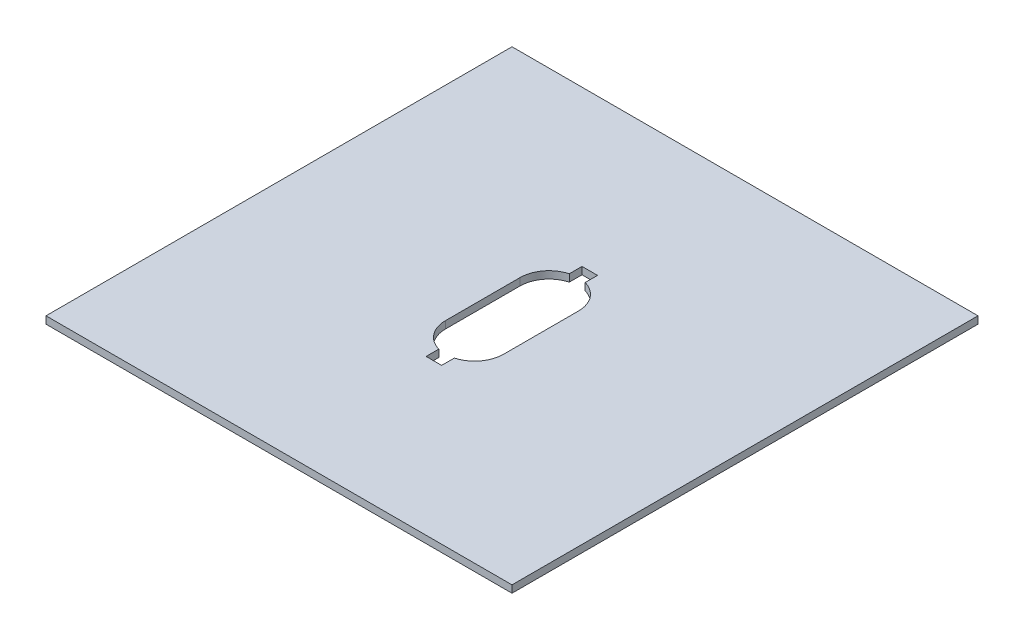
ISO-10303-21;
HEADER;
FILE_DESCRIPTION(('STEP AP214'),'2;1');
FILE_NAME('part.step','',(''),(''),'','','');
FILE_SCHEMA(('AUTOMOTIVE_DESIGN { 1 0 10303 214 1 1 1 1 }'));
ENDSEC;
DATA;
#1=APPLICATION_CONTEXT('core data for automotive mechanical design processes');
#2=APPLICATION_PROTOCOL_DEFINITION('international standard','automotive_design',2000,#1);
#3=PRODUCT_CONTEXT('',#1,'mechanical');
#4=PRODUCT('Part','Part','',(#3));
#5=PRODUCT_RELATED_PRODUCT_CATEGORY('part','',(#4));
#6=PRODUCT_DEFINITION_FORMATION('','',#4);
#7=PRODUCT_DEFINITION_CONTEXT('part definition',#1,'design');
#8=PRODUCT_DEFINITION('design','',#6,#7);
#9=PRODUCT_DEFINITION_SHAPE('','',#8);
#10=(LENGTH_UNIT() NAMED_UNIT(*) SI_UNIT(.MILLI.,.METRE.));
#11=(NAMED_UNIT(*) PLANE_ANGLE_UNIT() SI_UNIT($,.RADIAN.));
#12=(NAMED_UNIT(*) SI_UNIT($,.STERADIAN.) SOLID_ANGLE_UNIT());
#13=UNCERTAINTY_MEASURE_WITH_UNIT(LENGTH_MEASURE(1.E-05),#10,'distance_accuracy_value','');
#14=(GEOMETRIC_REPRESENTATION_CONTEXT(3) GLOBAL_UNCERTAINTY_ASSIGNED_CONTEXT((#13)) GLOBAL_UNIT_ASSIGNED_CONTEXT((#10,
#11,#12)) REPRESENTATION_CONTEXT('',''));
#15=CARTESIAN_POINT('',(0.,0.,0.));
#16=DIRECTION('',(0.,0.,1.));
#17=DIRECTION('',(1.,0.,0.));
#18=AXIS2_PLACEMENT_3D('',#15,#16,#17);
#19=CARTESIAN_POINT('',(152.4,2.38125,152.4));
#20=DIRECTION('',(-1.,0.,0.));
#21=DIRECTION('',(0.,0.,1.));
#22=AXIS2_PLACEMENT_3D('',#19,#20,#21);
#23=PLANE('',#22);
#24=DIRECTION('',(0.,0.,-1.));
#25=VECTOR('',#24,1.);
#26=CARTESIAN_POINT('',(152.4,-2.38125,152.4));
#27=LINE('',#26,#25);
#28=CARTESIAN_POINT('',(152.4,-2.38125,152.4));
#29=VERTEX_POINT('',#28);
#30=CARTESIAN_POINT('',(152.4,-2.38125,-152.4));
#31=VERTEX_POINT('',#30);
#32=EDGE_CURVE('E258',#29,#31,#27,.T.);
#33=ORIENTED_EDGE('',*,*,#32,.T.);
#34=DIRECTION('',(0.,-1.,0.));
#35=VECTOR('',#34,1.);
#36=CARTESIAN_POINT('',(152.4,2.38125,-152.4));
#37=LINE('',#36,#35);
#38=CARTESIAN_POINT('',(152.4,2.38125,-152.4));
#39=VERTEX_POINT('',#38);
#40=EDGE_CURVE('E11',#39,#31,#37,.T.);
#41=ORIENTED_EDGE('',*,*,#40,.F.);
#42=DIRECTION('',(0.,0.,-1.));
#43=VECTOR('',#42,1.);
#44=CARTESIAN_POINT('',(152.4,2.38125,152.4));
#45=LINE('',#44,#43);
#46=CARTESIAN_POINT('',(152.4,2.38125,152.4));
#47=VERTEX_POINT('',#46);
#48=EDGE_CURVE('E288',#47,#39,#45,.T.);
#49=ORIENTED_EDGE('',*,*,#48,.F.);
#50=DIRECTION('',(0.,-1.,0.));
#51=VECTOR('',#50,1.);
#52=CARTESIAN_POINT('',(152.4,2.38125,152.4));
#53=LINE('',#52,#51);
#54=EDGE_CURVE('E302',#47,#29,#53,.T.);
#55=ORIENTED_EDGE('',*,*,#54,.T.);
#56=EDGE_LOOP('',(#33,#41,#49,#55));
#57=FACE_BOUND('',#56,.T.);
#58=ADVANCED_FACE('F38',(#57),#23,.F.);
#59=CARTESIAN_POINT('',(-152.4,2.38125,-152.4));
#60=DIRECTION('',(0.,0.,1.));
#61=DIRECTION('',(1.,0.,0.));
#62=AXIS2_PLACEMENT_3D('',#59,#60,#61);
#63=PLANE('',#62);
#64=DIRECTION('',(-1.,0.,0.));
#65=VECTOR('',#64,1.);
#66=CARTESIAN_POINT('',(-152.4,-2.38125,-152.4));
#67=LINE('',#66,#65);
#68=CARTESIAN_POINT('',(-152.4,-2.38125,-152.4));
#69=VERTEX_POINT('',#68);
#70=EDGE_CURVE('E306',#31,#69,#67,.T.);
#71=ORIENTED_EDGE('',*,*,#70,.T.);
#72=DIRECTION('',(0.,-1.,0.));
#73=VECTOR('',#72,1.);
#74=CARTESIAN_POINT('',(-152.4,2.38125,-152.4));
#75=LINE('',#74,#73);
#76=CARTESIAN_POINT('',(-152.4,2.38125,-152.4));
#77=VERTEX_POINT('',#76);
#78=EDGE_CURVE('E46',#77,#69,#75,.T.);
#79=ORIENTED_EDGE('',*,*,#78,.F.);
#80=DIRECTION('',(-1.,0.,0.));
#81=VECTOR('',#80,1.);
#82=CARTESIAN_POINT('',(-152.4,2.38125,-152.4));
#83=LINE('',#82,#81);
#84=EDGE_CURVE('E292',#39,#77,#83,.T.);
#85=ORIENTED_EDGE('',*,*,#84,.F.);
#86=ORIENTED_EDGE('',*,*,#40,.T.);
#87=EDGE_LOOP('',(#71,#79,#85,#86));
#88=FACE_BOUND('',#87,.T.);
#89=ADVANCED_FACE('F340',(#88),#63,.F.);
#90=CARTESIAN_POINT('',(-152.4,2.38125,152.4));
#91=DIRECTION('',(1.,0.,0.));
#92=DIRECTION('',(0.,0.,-1.));
#93=AXIS2_PLACEMENT_3D('',#90,#91,#92);
#94=PLANE('',#93);
#95=DIRECTION('',(0.,0.,1.));
#96=VECTOR('',#95,1.);
#97=CARTESIAN_POINT('',(-152.4,-2.38125,152.4));
#98=LINE('',#97,#96);
#99=CARTESIAN_POINT('',(-152.4,-2.38125,152.4));
#100=VERTEX_POINT('',#99);
#101=EDGE_CURVE('E309',#69,#100,#98,.T.);
#102=ORIENTED_EDGE('',*,*,#101,.T.);
#103=DIRECTION('',(0.,-1.,0.));
#104=VECTOR('',#103,1.);
#105=CARTESIAN_POINT('',(-152.4,2.38125,152.4));
#106=LINE('',#105,#104);
#107=CARTESIAN_POINT('',(-152.4,2.38125,152.4));
#108=VERTEX_POINT('',#107);
#109=EDGE_CURVE('E317',#108,#100,#106,.T.);
#110=ORIENTED_EDGE('',*,*,#109,.F.);
#111=DIRECTION('',(0.,0.,1.));
#112=VECTOR('',#111,1.);
#113=CARTESIAN_POINT('',(-152.4,2.38125,152.4));
#114=LINE('',#113,#112);
#115=EDGE_CURVE('E296',#77,#108,#114,.T.);
#116=ORIENTED_EDGE('',*,*,#115,.F.);
#117=ORIENTED_EDGE('',*,*,#78,.T.);
#118=EDGE_LOOP('',(#102,#110,#116,#117));
#119=FACE_BOUND('',#118,.T.);
#120=ADVANCED_FACE('F326',(#119),#94,.F.);
#121=CARTESIAN_POINT('',(-152.4,2.38125,152.4));
#122=DIRECTION('',(0.,0.,-1.));
#123=DIRECTION('',(-1.,0.,0.));
#124=AXIS2_PLACEMENT_3D('',#121,#122,#123);
#125=PLANE('',#124);
#126=DIRECTION('',(1.,0.,0.));
#127=VECTOR('',#126,1.);
#128=CARTESIAN_POINT('',(-152.4,-2.38125,152.4));
#129=LINE('',#128,#127);
#130=EDGE_CURVE('E293',#100,#29,#129,.T.);
#131=ORIENTED_EDGE('',*,*,#130,.T.);
#132=ORIENTED_EDGE('',*,*,#54,.F.);
#133=DIRECTION('',(1.,0.,0.));
#134=VECTOR('',#133,1.);
#135=CARTESIAN_POINT('',(-152.4,2.38125,152.4));
#136=LINE('',#135,#134);
#137=EDGE_CURVE('E299',#108,#47,#136,.T.);
#138=ORIENTED_EDGE('',*,*,#137,.F.);
#139=ORIENTED_EDGE('',*,*,#109,.T.);
#140=EDGE_LOOP('',(#131,#132,#138,#139));
#141=FACE_BOUND('',#140,.T.);
#142=ADVANCED_FACE('F333',(#141),#125,.F.);
#143=CARTESIAN_POINT('',(0.,2.38125,0.));
#144=DIRECTION('',(0.,-1.,0.));
#145=DIRECTION('',(0.,0.,-1.));
#146=AXIS2_PLACEMENT_3D('',#143,#144,#145);
#147=PLANE('',#146);
#148=DIRECTION('',(1.,0.,0.));
#149=VECTOR('',#148,1.);
#150=CARTESIAN_POINT('',(-5.07999999999997,2.38125,51.1060329097476));
#151=LINE('',#150,#149);
#152=CARTESIAN_POINT('',(-5.07999999999997,2.38125,51.1060329097476));
#153=VERTEX_POINT('',#152);
#154=CARTESIAN_POINT('',(5.08000000000003,2.38125,51.1060329097476));
#155=VERTEX_POINT('',#154);
#156=EDGE_CURVE('E217',#153,#155,#151,.T.);
#157=ORIENTED_EDGE('',*,*,#156,.F.);
#158=DIRECTION('',(0.,0.,1.));
#159=VECTOR('',#158,1.);
#160=CARTESIAN_POINT('',(-5.07999999999997,2.38125,42.7952542561009));
#161=LINE('',#160,#159);
#162=CARTESIAN_POINT('',(-5.07999999999998,2.38125,42.7952542561009));
#163=VERTEX_POINT('',#162);
#164=EDGE_CURVE('E53',#163,#153,#161,.T.);
#165=ORIENTED_EDGE('',*,*,#164,.F.);
#166=CARTESIAN_POINT('',(-1.2490009027033E-13,2.38125,24.4614329097476));
#167=DIRECTION('',(0.,1.,0.));
#168=DIRECTION('',(0.,0.,1.));
#169=AXIS2_PLACEMENT_3D('',#166,#167,#168);
#170=CIRCLE('',#169,19.0245999999999);
#171=CARTESIAN_POINT('',(-19.0246000000001,2.38125,24.4614329097476));
#172=VERTEX_POINT('',#171);
#173=EDGE_CURVE('E173',#172,#163,#170,.T.);
#174=ORIENTED_EDGE('',*,*,#173,.F.);
#175=DIRECTION('',(0.,0.,1.));
#176=VECTOR('',#175,1.);
#177=CARTESIAN_POINT('',(-19.0246000000001,2.38125,-24.2303670902525));
#178=LINE('',#177,#176);
#179=CARTESIAN_POINT('',(-19.0246000000001,2.38125,-24.2303670902525));
#180=VERTEX_POINT('',#179);
#181=EDGE_CURVE('E177',#180,#172,#178,.T.);
#182=ORIENTED_EDGE('',*,*,#181,.F.);
#183=CARTESIAN_POINT('',(0.,2.38125,-24.2303670902525));
#184=DIRECTION('',(0.,1.,0.));
#185=DIRECTION('',(0.,0.,-1.));
#186=AXIS2_PLACEMENT_3D('',#183,#184,#185);
#187=CIRCLE('',#186,19.0246000000001);
#188=CARTESIAN_POINT('',(-5.08,2.38125,-42.5641884366059));
#189=VERTEX_POINT('',#188);
#190=EDGE_CURVE('E248',#189,#180,#187,.T.);
#191=ORIENTED_EDGE('',*,*,#190,.F.);
#192=DIRECTION('',(0.,0.,1.));
#193=VECTOR('',#192,1.);
#194=CARTESIAN_POINT('',(-5.08,2.38125,-50.8749670902526));
#195=LINE('',#194,#193);
#196=CARTESIAN_POINT('',(-5.08,2.38125,-50.8749670902526));
#197=VERTEX_POINT('',#196);
#198=EDGE_CURVE('E244',#197,#189,#195,.T.);
#199=ORIENTED_EDGE('',*,*,#198,.F.);
#200=DIRECTION('',(-1.,0.,0.));
#201=VECTOR('',#200,1.);
#202=CARTESIAN_POINT('',(5.08000000000004,2.38125,-50.8749670902526));
#203=LINE('',#202,#201);
#204=CARTESIAN_POINT('',(5.08000000000004,2.38125,-50.8749670902526));
#205=VERTEX_POINT('',#204);
#206=EDGE_CURVE('E240',#205,#197,#203,.T.);
#207=ORIENTED_EDGE('',*,*,#206,.F.);
#208=DIRECTION('',(0.,0.,-1.));
#209=VECTOR('',#208,1.);
#210=CARTESIAN_POINT('',(5.08000000000004,2.38125,-42.7952542561009));
#211=LINE('',#210,#209);
#212=CARTESIAN_POINT('',(5.08000000000003,2.38125,-42.7952542561009));
#213=VERTEX_POINT('',#212);
#214=EDGE_CURVE('E236',#213,#205,#211,.T.);
#215=ORIENTED_EDGE('',*,*,#214,.F.);
#216=CARTESIAN_POINT('',(0.,2.38125,-24.4614329097475));
#217=DIRECTION('',(0.,1.,0.));
#218=DIRECTION('',(0.,0.,1.));
#219=AXIS2_PLACEMENT_3D('',#216,#217,#218);
#220=CIRCLE('',#219,19.0246000000001);
#221=CARTESIAN_POINT('',(19.0246000000001,2.38125,-24.4614329097475));
#222=VERTEX_POINT('',#221);
#223=EDGE_CURVE('E232',#222,#213,#220,.T.);
#224=ORIENTED_EDGE('',*,*,#223,.F.);
#225=DIRECTION('',(0.,0.,-1.));
#226=VECTOR('',#225,1.);
#227=CARTESIAN_POINT('',(19.0246000000001,2.38125,24.4614329097475));
#228=LINE('',#227,#226);
#229=CARTESIAN_POINT('',(19.0246000000001,2.38125,24.4614329097475));
#230=VERTEX_POINT('',#229);
#231=EDGE_CURVE('E228',#230,#222,#228,.T.);
#232=ORIENTED_EDGE('',*,*,#231,.F.);
#233=CARTESIAN_POINT('',(0.,2.38125,24.4614329097475));
#234=DIRECTION('',(0.,1.,0.));
#235=DIRECTION('',(0.,0.,1.));
#236=AXIS2_PLACEMENT_3D('',#233,#234,#235);
#237=CIRCLE('',#236,19.0246000000001);
#238=CARTESIAN_POINT('',(5.08000000000003,2.38125,42.7952542561009));
#239=VERTEX_POINT('',#238);
#240=EDGE_CURVE('E224',#239,#230,#237,.T.);
#241=ORIENTED_EDGE('',*,*,#240,.F.);
#242=DIRECTION('',(0.,0.,-1.));
#243=VECTOR('',#242,1.);
#244=CARTESIAN_POINT('',(5.08000000000003,2.38125,51.1060329097476));
#245=LINE('',#244,#243);
#246=EDGE_CURVE('E220',#155,#239,#245,.T.);
#247=ORIENTED_EDGE('',*,*,#246,.F.);
#248=EDGE_LOOP('',(#157,#165,#174,#182,#191,#199,#207,#215,#224,#232,#241,#247));
#249=FACE_BOUND('',#248,.T.);
#250=ORIENTED_EDGE('',*,*,#48,.T.);
#251=ORIENTED_EDGE('',*,*,#84,.T.);
#252=ORIENTED_EDGE('',*,*,#115,.T.);
#253=ORIENTED_EDGE('',*,*,#137,.T.);
#254=EDGE_LOOP('',(#250,#251,#252,#253));
#255=FACE_BOUND('',#254,.T.);
#256=ADVANCED_FACE('F339',(#249,#255),#147,.F.);
#257=CARTESIAN_POINT('',(0.,-2.38125,0.));
#258=DIRECTION('',(0.,-1.,0.));
#259=DIRECTION('',(0.,0.,-1.));
#260=AXIS2_PLACEMENT_3D('',#257,#258,#259);
#261=PLANE('',#260);
#262=DIRECTION('',(0.,0.,1.));
#263=VECTOR('',#262,1.);
#264=CARTESIAN_POINT('',(-5.07999999999997,-2.38125,42.7952542561009));
#265=LINE('',#264,#263);
#266=CARTESIAN_POINT('',(-5.07999999999998,-2.38125,42.7952542561009));
#267=VERTEX_POINT('',#266);
#268=CARTESIAN_POINT('',(-5.07999999999997,-2.38125,51.1060329097476));
#269=VERTEX_POINT('',#268);
#270=EDGE_CURVE('E153',#267,#269,#265,.T.);
#271=ORIENTED_EDGE('',*,*,#270,.T.);
#272=DIRECTION('',(1.,0.,0.));
#273=VECTOR('',#272,1.);
#274=CARTESIAN_POINT('',(-5.07999999999997,-2.38125,51.1060329097476));
#275=LINE('',#274,#273);
#276=CARTESIAN_POINT('',(5.08000000000003,-2.38125,51.1060329097476));
#277=VERTEX_POINT('',#276);
#278=EDGE_CURVE('E163',#269,#277,#275,.T.);
#279=ORIENTED_EDGE('',*,*,#278,.T.);
#280=DIRECTION('',(0.,0.,-1.));
#281=VECTOR('',#280,1.);
#282=CARTESIAN_POINT('',(5.08000000000003,-2.38125,51.1060329097476));
#283=LINE('',#282,#281);
#284=CARTESIAN_POINT('',(5.08000000000003,-2.38125,42.7952542561009));
#285=VERTEX_POINT('',#284);
#286=EDGE_CURVE('E61',#277,#285,#283,.T.);
#287=ORIENTED_EDGE('',*,*,#286,.T.);
#288=CARTESIAN_POINT('',(0.,-2.38125,24.4614329097475));
#289=DIRECTION('',(0.,1.,0.));
#290=DIRECTION('',(0.,0.,1.));
#291=AXIS2_PLACEMENT_3D('',#288,#289,#290);
#292=CIRCLE('',#291,19.0246000000001);
#293=CARTESIAN_POINT('',(19.0246000000001,-2.38125,24.4614329097475));
#294=VERTEX_POINT('',#293);
#295=EDGE_CURVE('E182',#285,#294,#292,.T.);
#296=ORIENTED_EDGE('',*,*,#295,.T.);
#297=DIRECTION('',(0.,0.,-1.));
#298=VECTOR('',#297,1.);
#299=CARTESIAN_POINT('',(19.0246000000001,-2.38125,24.4614329097475));
#300=LINE('',#299,#298);
#301=CARTESIAN_POINT('',(19.0246000000001,-2.38125,-24.4614329097475));
#302=VERTEX_POINT('',#301);
#303=EDGE_CURVE('E186',#294,#302,#300,.T.);
#304=ORIENTED_EDGE('',*,*,#303,.T.);
#305=CARTESIAN_POINT('',(0.,-2.38125,-24.4614329097475));
#306=DIRECTION('',(0.,1.,0.));
#307=DIRECTION('',(0.,0.,1.));
#308=AXIS2_PLACEMENT_3D('',#305,#306,#307);
#309=CIRCLE('',#308,19.0246000000001);
#310=CARTESIAN_POINT('',(5.08000000000003,-2.38125,-42.7952542561009));
#311=VERTEX_POINT('',#310);
#312=EDGE_CURVE('E190',#302,#311,#309,.T.);
#313=ORIENTED_EDGE('',*,*,#312,.T.);
#314=DIRECTION('',(0.,0.,-1.));
#315=VECTOR('',#314,1.);
#316=CARTESIAN_POINT('',(5.08000000000004,-2.38125,-42.7952542561009));
#317=LINE('',#316,#315);
#318=CARTESIAN_POINT('',(5.08000000000004,-2.38125,-50.8749670902526));
#319=VERTEX_POINT('',#318);
#320=EDGE_CURVE('E194',#311,#319,#317,.T.);
#321=ORIENTED_EDGE('',*,*,#320,.T.);
#322=DIRECTION('',(-1.,0.,0.));
#323=VECTOR('',#322,1.);
#324=CARTESIAN_POINT('',(5.08000000000004,-2.38125,-50.8749670902526));
#325=LINE('',#324,#323);
#326=CARTESIAN_POINT('',(-5.08,-2.38125,-50.8749670902526));
#327=VERTEX_POINT('',#326);
#328=EDGE_CURVE('E198',#319,#327,#325,.T.);
#329=ORIENTED_EDGE('',*,*,#328,.T.);
#330=DIRECTION('',(0.,0.,1.));
#331=VECTOR('',#330,1.);
#332=CARTESIAN_POINT('',(-5.08,-2.38125,-50.8749670902526));
#333=LINE('',#332,#331);
#334=CARTESIAN_POINT('',(-5.08,-2.38125,-42.5641884366059));
#335=VERTEX_POINT('',#334);
#336=EDGE_CURVE('E202',#327,#335,#333,.T.);
#337=ORIENTED_EDGE('',*,*,#336,.T.);
#338=CARTESIAN_POINT('',(0.,-2.38125,-24.2303670902525));
#339=DIRECTION('',(0.,1.,0.));
#340=DIRECTION('',(0.,0.,-1.));
#341=AXIS2_PLACEMENT_3D('',#338,#339,#340);
#342=CIRCLE('',#341,19.0246000000001);
#343=CARTESIAN_POINT('',(-19.0246000000001,-2.38125,-24.2303670902525));
#344=VERTEX_POINT('',#343);
#345=EDGE_CURVE('E206',#335,#344,#342,.T.);
#346=ORIENTED_EDGE('',*,*,#345,.T.);
#347=DIRECTION('',(0.,0.,1.));
#348=VECTOR('',#347,1.);
#349=CARTESIAN_POINT('',(-19.0246000000001,-2.38125,-24.2303670902525));
#350=LINE('',#349,#348);
#351=CARTESIAN_POINT('',(-19.0246000000001,-2.38125,24.4614329097476));
#352=VERTEX_POINT('',#351);
#353=EDGE_CURVE('E210',#344,#352,#350,.T.);
#354=ORIENTED_EDGE('',*,*,#353,.T.);
#355=CARTESIAN_POINT('',(-1.2490009027033E-13,-2.38125,24.4614329097476));
#356=DIRECTION('',(0.,1.,0.));
#357=DIRECTION('',(0.,0.,1.));
#358=AXIS2_PLACEMENT_3D('',#355,#356,#357);
#359=CIRCLE('',#358,19.0245999999999);
#360=EDGE_CURVE('E160',#352,#267,#359,.T.);
#361=ORIENTED_EDGE('',*,*,#360,.T.);
#362=EDGE_LOOP('',(#271,#279,#287,#296,#304,#313,#321,#329,#337,#346,#354,#361));
#363=FACE_BOUND('',#362,.T.);
#364=ORIENTED_EDGE('',*,*,#32,.F.);
#365=ORIENTED_EDGE('',*,*,#130,.F.);
#366=ORIENTED_EDGE('',*,*,#101,.F.);
#367=ORIENTED_EDGE('',*,*,#70,.F.);
#368=EDGE_LOOP('',(#364,#365,#366,#367));
#369=FACE_BOUND('',#368,.T.);
#370=ADVANCED_FACE('F168',(#363,#369),#261,.T.);
#371=CARTESIAN_POINT('',(-5.07999999999997,-2.38125,42.7952542561009));
#372=DIRECTION('',(-1.,0.,0.));
#373=DIRECTION('',(0.,0.,1.));
#374=AXIS2_PLACEMENT_3D('',#371,#372,#373);
#375=PLANE('',#374);
#376=ORIENTED_EDGE('',*,*,#164,.T.);
#377=DIRECTION('',(0.,1.,0.));
#378=VECTOR('',#377,1.);
#379=CARTESIAN_POINT('',(-5.07999999999997,-2.38125,51.1060329097476));
#380=LINE('',#379,#378);
#381=EDGE_CURVE('E149',#269,#153,#380,.T.);
#382=ORIENTED_EDGE('',*,*,#381,.F.);
#383=ORIENTED_EDGE('',*,*,#270,.F.);
#384=DIRECTION('',(0.,1.,0.));
#385=VECTOR('',#384,1.);
#386=CARTESIAN_POINT('',(-5.07999999999998,-2.38125,42.7952542561009));
#387=LINE('',#386,#385);
#388=EDGE_CURVE('E255',#267,#163,#387,.T.);
#389=ORIENTED_EDGE('',*,*,#388,.T.);
#390=EDGE_LOOP('',(#376,#382,#383,#389));
#391=FACE_BOUND('',#390,.T.);
#392=ADVANCED_FACE('F151',(#391),#375,.F.);
#393=CARTESIAN_POINT('',(-1.2490009027033E-13,-2.38125,24.4614329097476));
#394=DIRECTION('',(0.,1.,0.));
#395=DIRECTION('',(0.,0.,1.));
#396=AXIS2_PLACEMENT_3D('',#393,#394,#395);
#397=CYLINDRICAL_SURFACE('',#396,19.0245999999999);
#398=ORIENTED_EDGE('',*,*,#173,.T.);
#399=ORIENTED_EDGE('',*,*,#388,.F.);
#400=ORIENTED_EDGE('',*,*,#360,.F.);
#401=DIRECTION('',(0.,1.,0.));
#402=VECTOR('',#401,1.);
#403=CARTESIAN_POINT('',(-19.0246000000001,-2.38125,24.4614329097476));
#404=LINE('',#403,#402);
#405=EDGE_CURVE('E259',#352,#172,#404,.T.);
#406=ORIENTED_EDGE('',*,*,#405,.T.);
#407=EDGE_LOOP('',(#398,#399,#400,#406));
#408=FACE_BOUND('',#407,.T.);
#409=ADVANCED_FACE('F357',(#408),#397,.F.);
#410=CARTESIAN_POINT('',(-19.0246000000001,-2.38125,-24.2303670902525));
#411=DIRECTION('',(-1.,0.,0.));
#412=DIRECTION('',(0.,0.,1.));
#413=AXIS2_PLACEMENT_3D('',#410,#411,#412);
#414=PLANE('',#413);
#415=ORIENTED_EDGE('',*,*,#181,.T.);
#416=ORIENTED_EDGE('',*,*,#405,.F.);
#417=ORIENTED_EDGE('',*,*,#353,.F.);
#418=DIRECTION('',(0.,1.,0.));
#419=VECTOR('',#418,1.);
#420=CARTESIAN_POINT('',(-19.0246000000001,-2.38125,-24.2303670902525));
#421=LINE('',#420,#419);
#422=EDGE_CURVE('E262',#344,#180,#421,.T.);
#423=ORIENTED_EDGE('',*,*,#422,.T.);
#424=EDGE_LOOP('',(#415,#416,#417,#423));
#425=FACE_BOUND('',#424,.T.);
#426=ADVANCED_FACE('F390',(#425),#414,.F.);
#427=CARTESIAN_POINT('',(0.,-2.38125,-24.2303670902525));
#428=DIRECTION('',(0.,1.,0.));
#429=DIRECTION('',(0.,0.,1.));
#430=AXIS2_PLACEMENT_3D('',#427,#428,#429);
#431=CYLINDRICAL_SURFACE('',#430,19.0246000000001);
#432=ORIENTED_EDGE('',*,*,#190,.T.);
#433=ORIENTED_EDGE('',*,*,#422,.F.);
#434=ORIENTED_EDGE('',*,*,#345,.F.);
#435=DIRECTION('',(0.,1.,0.));
#436=VECTOR('',#435,1.);
#437=CARTESIAN_POINT('',(-5.08,-2.38125,-42.5641884366059));
#438=LINE('',#437,#436);
#439=EDGE_CURVE('E265',#335,#189,#438,.T.);
#440=ORIENTED_EDGE('',*,*,#439,.T.);
#441=EDGE_LOOP('',(#432,#433,#434,#440));
#442=FACE_BOUND('',#441,.T.);
#443=ADVANCED_FACE('F386',(#442),#431,.F.);
#444=CARTESIAN_POINT('',(-5.08,-2.38125,-50.8749670902526));
#445=DIRECTION('',(-1.,0.,0.));
#446=DIRECTION('',(0.,0.,1.));
#447=AXIS2_PLACEMENT_3D('',#444,#445,#446);
#448=PLANE('',#447);
#449=ORIENTED_EDGE('',*,*,#198,.T.);
#450=ORIENTED_EDGE('',*,*,#439,.F.);
#451=ORIENTED_EDGE('',*,*,#336,.F.);
#452=DIRECTION('',(0.,1.,0.));
#453=VECTOR('',#452,1.);
#454=CARTESIAN_POINT('',(-5.08,-2.38125,-50.8749670902526));
#455=LINE('',#454,#453);
#456=EDGE_CURVE('E268',#327,#197,#455,.T.);
#457=ORIENTED_EDGE('',*,*,#456,.T.);
#458=EDGE_LOOP('',(#449,#450,#451,#457));
#459=FACE_BOUND('',#458,.T.);
#460=ADVANCED_FACE('F382',(#459),#448,.F.);
#461=CARTESIAN_POINT('',(5.08000000000004,-2.38125,-50.8749670902526));
#462=DIRECTION('',(0.,0.,-1.));
#463=DIRECTION('',(-1.,0.,0.));
#464=AXIS2_PLACEMENT_3D('',#461,#462,#463);
#465=PLANE('',#464);
#466=ORIENTED_EDGE('',*,*,#206,.T.);
#467=ORIENTED_EDGE('',*,*,#456,.F.);
#468=ORIENTED_EDGE('',*,*,#328,.F.);
#469=DIRECTION('',(0.,1.,0.));
#470=VECTOR('',#469,1.);
#471=CARTESIAN_POINT('',(5.08000000000004,-2.38125,-50.8749670902526));
#472=LINE('',#471,#470);
#473=EDGE_CURVE('E271',#319,#205,#472,.T.);
#474=ORIENTED_EDGE('',*,*,#473,.T.);
#475=EDGE_LOOP('',(#466,#467,#468,#474));
#476=FACE_BOUND('',#475,.T.);
#477=ADVANCED_FACE('F378',(#476),#465,.F.);
#478=CARTESIAN_POINT('',(5.08000000000004,-2.38125,-42.7952542561009));
#479=DIRECTION('',(1.,0.,0.));
#480=DIRECTION('',(0.,0.,-1.));
#481=AXIS2_PLACEMENT_3D('',#478,#479,#480);
#482=PLANE('',#481);
#483=ORIENTED_EDGE('',*,*,#214,.T.);
#484=ORIENTED_EDGE('',*,*,#473,.F.);
#485=ORIENTED_EDGE('',*,*,#320,.F.);
#486=DIRECTION('',(0.,1.,0.));
#487=VECTOR('',#486,1.);
#488=CARTESIAN_POINT('',(5.08000000000003,-2.38125,-42.7952542561009));
#489=LINE('',#488,#487);
#490=EDGE_CURVE('E274',#311,#213,#489,.T.);
#491=ORIENTED_EDGE('',*,*,#490,.T.);
#492=EDGE_LOOP('',(#483,#484,#485,#491));
#493=FACE_BOUND('',#492,.T.);
#494=ADVANCED_FACE('F374',(#493),#482,.F.);
#495=CARTESIAN_POINT('',(0.,-2.38125,-24.4614329097475));
#496=DIRECTION('',(0.,1.,0.));
#497=DIRECTION('',(0.,0.,1.));
#498=AXIS2_PLACEMENT_3D('',#495,#496,#497);
#499=CYLINDRICAL_SURFACE('',#498,19.0246000000001);
#500=ORIENTED_EDGE('',*,*,#223,.T.);
#501=ORIENTED_EDGE('',*,*,#490,.F.);
#502=ORIENTED_EDGE('',*,*,#312,.F.);
#503=DIRECTION('',(0.,1.,0.));
#504=VECTOR('',#503,1.);
#505=CARTESIAN_POINT('',(19.0246000000001,-2.38125,-24.4614329097475));
#506=LINE('',#505,#504);
#507=EDGE_CURVE('E277',#302,#222,#506,.T.);
#508=ORIENTED_EDGE('',*,*,#507,.T.);
#509=EDGE_LOOP('',(#500,#501,#502,#508));
#510=FACE_BOUND('',#509,.T.);
#511=ADVANCED_FACE('F370',(#510),#499,.F.);
#512=CARTESIAN_POINT('',(19.0246000000001,-2.38125,24.4614329097475));
#513=DIRECTION('',(1.,0.,0.));
#514=DIRECTION('',(0.,0.,-1.));
#515=AXIS2_PLACEMENT_3D('',#512,#513,#514);
#516=PLANE('',#515);
#517=ORIENTED_EDGE('',*,*,#231,.T.);
#518=ORIENTED_EDGE('',*,*,#507,.F.);
#519=ORIENTED_EDGE('',*,*,#303,.F.);
#520=DIRECTION('',(0.,1.,0.));
#521=VECTOR('',#520,1.);
#522=CARTESIAN_POINT('',(19.0246000000001,-2.38125,24.4614329097475));
#523=LINE('',#522,#521);
#524=EDGE_CURVE('E280',#294,#230,#523,.T.);
#525=ORIENTED_EDGE('',*,*,#524,.T.);
#526=EDGE_LOOP('',(#517,#518,#519,#525));
#527=FACE_BOUND('',#526,.T.);
#528=ADVANCED_FACE('F366',(#527),#516,.F.);
#529=CARTESIAN_POINT('',(0.,-2.38125,24.4614329097475));
#530=DIRECTION('',(0.,1.,0.));
#531=DIRECTION('',(0.,0.,1.));
#532=AXIS2_PLACEMENT_3D('',#529,#530,#531);
#533=CYLINDRICAL_SURFACE('',#532,19.0246000000001);
#534=ORIENTED_EDGE('',*,*,#240,.T.);
#535=ORIENTED_EDGE('',*,*,#524,.F.);
#536=ORIENTED_EDGE('',*,*,#295,.F.);
#537=DIRECTION('',(0.,1.,0.));
#538=VECTOR('',#537,1.);
#539=CARTESIAN_POINT('',(5.08000000000003,-2.38125,42.7952542561009));
#540=LINE('',#539,#538);
#541=EDGE_CURVE('E283',#285,#239,#540,.T.);
#542=ORIENTED_EDGE('',*,*,#541,.T.);
#543=EDGE_LOOP('',(#534,#535,#536,#542));
#544=FACE_BOUND('',#543,.T.);
#545=ADVANCED_FACE('F363',(#544),#533,.F.);
#546=CARTESIAN_POINT('',(5.08000000000003,-2.38125,51.1060329097476));
#547=DIRECTION('',(1.,0.,0.));
#548=DIRECTION('',(0.,0.,-1.));
#549=AXIS2_PLACEMENT_3D('',#546,#547,#548);
#550=PLANE('',#549);
#551=ORIENTED_EDGE('',*,*,#246,.T.);
#552=ORIENTED_EDGE('',*,*,#541,.F.);
#553=ORIENTED_EDGE('',*,*,#286,.F.);
#554=DIRECTION('',(0.,1.,0.));
#555=VECTOR('',#554,1.);
#556=CARTESIAN_POINT('',(5.08000000000003,-2.38125,51.1060329097476));
#557=LINE('',#556,#555);
#558=EDGE_CURVE('E159',#277,#155,#557,.T.);
#559=ORIENTED_EDGE('',*,*,#558,.T.);
#560=EDGE_LOOP('',(#551,#552,#553,#559));
#561=FACE_BOUND('',#560,.T.);
#562=ADVANCED_FACE('F360',(#561),#550,.F.);
#563=CARTESIAN_POINT('',(-5.07999999999997,-2.38125,51.1060329097476));
#564=DIRECTION('',(0.,0.,1.));
#565=DIRECTION('',(1.,0.,0.));
#566=AXIS2_PLACEMENT_3D('',#563,#564,#565);
#567=PLANE('',#566);
#568=ORIENTED_EDGE('',*,*,#156,.T.);
#569=ORIENTED_EDGE('',*,*,#558,.F.);
#570=ORIENTED_EDGE('',*,*,#278,.F.);
#571=ORIENTED_EDGE('',*,*,#381,.T.);
#572=EDGE_LOOP('',(#568,#569,#570,#571));
#573=FACE_BOUND('',#572,.T.);
#574=ADVANCED_FACE('F164',(#573),#567,.F.);
#575=CLOSED_SHELL('',(#58,#89,#120,#142,#256,#370,#392,#409,#426,#443,#460,#477,#494,#511,#528,
#545,#562,#574));
#576=MANIFOLD_SOLID_BREP('B2',#575);
#577=ADVANCED_BREP_SHAPE_REPRESENTATION('',(#18,#576),#14);
#578=SHAPE_DEFINITION_REPRESENTATION(#9,#577);
ENDSEC;
END-ISO-10303-21;
